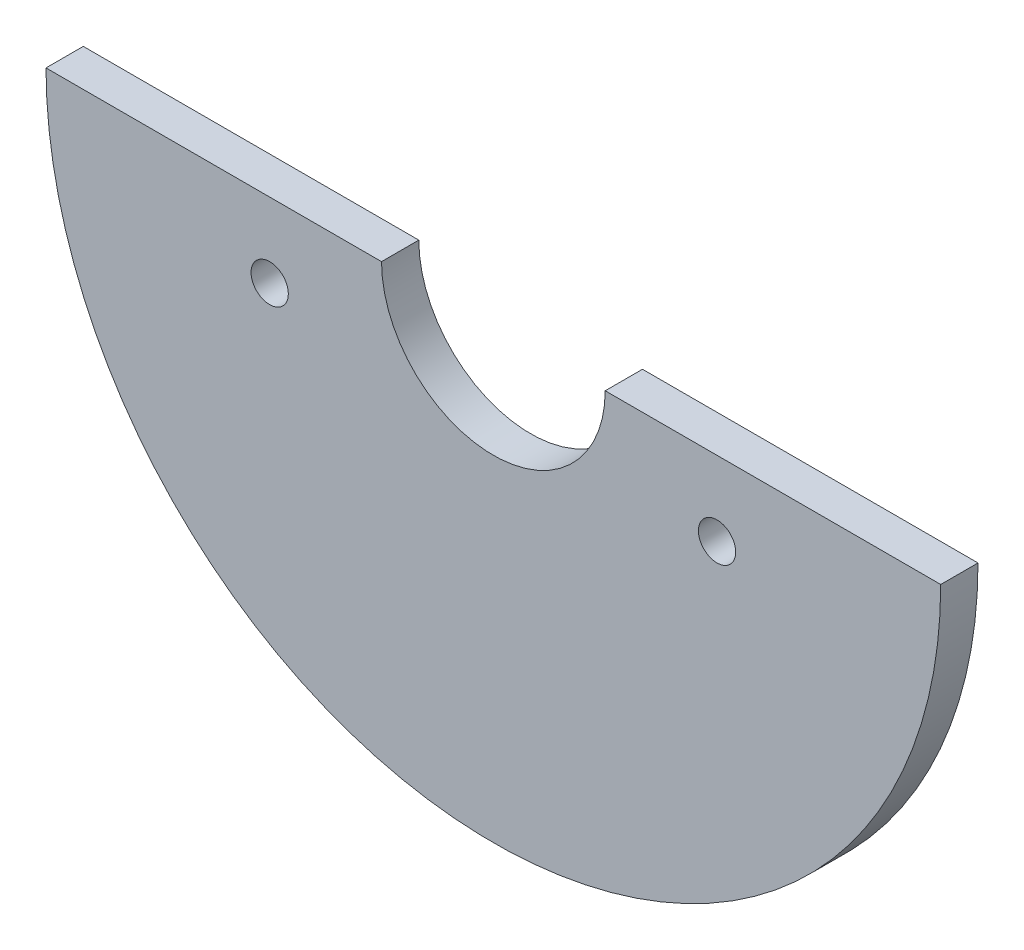
ISO-10303-21;
HEADER;
FILE_DESCRIPTION(('STEP AP214'),'2;1');
FILE_NAME('part.step','',(''),(''),'','','');
FILE_SCHEMA(('AUTOMOTIVE_DESIGN { 1 0 10303 214 1 1 1 1 }'));
ENDSEC;
DATA;
#1=APPLICATION_CONTEXT('core data for automotive mechanical design processes');
#2=APPLICATION_PROTOCOL_DEFINITION('international standard','automotive_design',2000,#1);
#3=PRODUCT_CONTEXT('',#1,'mechanical');
#4=PRODUCT('Part','Part','',(#3));
#5=PRODUCT_RELATED_PRODUCT_CATEGORY('part','',(#4));
#6=PRODUCT_DEFINITION_FORMATION('','',#4);
#7=PRODUCT_DEFINITION_CONTEXT('part definition',#1,'design');
#8=PRODUCT_DEFINITION('design','',#6,#7);
#9=PRODUCT_DEFINITION_SHAPE('','',#8);
#10=(LENGTH_UNIT() NAMED_UNIT(*) SI_UNIT(.MILLI.,.METRE.));
#11=(NAMED_UNIT(*) PLANE_ANGLE_UNIT() SI_UNIT($,.RADIAN.));
#12=(NAMED_UNIT(*) SI_UNIT($,.STERADIAN.) SOLID_ANGLE_UNIT());
#13=UNCERTAINTY_MEASURE_WITH_UNIT(LENGTH_MEASURE(1.E-05),#10,'distance_accuracy_value','');
#14=(GEOMETRIC_REPRESENTATION_CONTEXT(3) GLOBAL_UNCERTAINTY_ASSIGNED_CONTEXT((#13)) GLOBAL_UNIT_ASSIGNED_CONTEXT((#10,
#11,#12)) REPRESENTATION_CONTEXT('',''));
#15=CARTESIAN_POINT('',(0.,0.,0.));
#16=DIRECTION('',(0.,0.,1.));
#17=DIRECTION('',(1.,0.,0.));
#18=AXIS2_PLACEMENT_3D('',#15,#16,#17);
#19=CARTESIAN_POINT('',(0.,0.,5.));
#20=DIRECTION('',(0.,0.,1.));
#21=DIRECTION('',(1.,0.,0.));
#22=AXIS2_PLACEMENT_3D('',#19,#20,#21);
#23=PLANE('',#22);
#24=CARTESIAN_POINT('',(30.,-10.,5.));
#25=DIRECTION('',(0.,0.,1.));
#26=DIRECTION('',(1.,0.,0.));
#27=AXIS2_PLACEMENT_3D('',#24,#25,#26);
#28=CIRCLE('',#27,2.5);
#29=CARTESIAN_POINT('',(32.5,-10.,5.));
#30=VERTEX_POINT('',#29);
#31=EDGE_CURVE('E104',#30,#30,#28,.T.);
#32=ORIENTED_EDGE('',*,*,#31,.F.);
#33=EDGE_LOOP('',(#32));
#34=FACE_BOUND('',#33,.T.);
#35=CARTESIAN_POINT('',(0.,0.,5.));
#36=DIRECTION('',(0.,0.,1.));
#37=DIRECTION('',(1.,0.,0.));
#38=AXIS2_PLACEMENT_3D('',#35,#36,#37);
#39=CIRCLE('',#38,60.);
#40=CARTESIAN_POINT('',(-60.,0.,5.));
#41=VERTEX_POINT('',#40);
#42=CARTESIAN_POINT('',(60.,0.,5.));
#43=VERTEX_POINT('',#42);
#44=EDGE_CURVE('E89',#41,#43,#39,.T.);
#45=ORIENTED_EDGE('',*,*,#44,.T.);
#46=DIRECTION('',(-1.,0.,0.));
#47=VECTOR('',#46,1.);
#48=CARTESIAN_POINT('',(15.,0.,5.));
#49=LINE('',#48,#47);
#50=CARTESIAN_POINT('',(15.,0.,5.));
#51=VERTEX_POINT('',#50);
#52=EDGE_CURVE('E84',#43,#51,#49,.T.);
#53=ORIENTED_EDGE('',*,*,#52,.T.);
#54=CARTESIAN_POINT('',(0.,0.,5.));
#55=DIRECTION('',(0.,0.,-1.));
#56=DIRECTION('',(1.,0.,0.));
#57=AXIS2_PLACEMENT_3D('',#54,#55,#56);
#58=CIRCLE('',#57,15.);
#59=CARTESIAN_POINT('',(-15.,0.,5.));
#60=VERTEX_POINT('',#59);
#61=EDGE_CURVE('E87',#51,#60,#58,.T.);
#62=ORIENTED_EDGE('',*,*,#61,.T.);
#63=DIRECTION('',(-1.,0.,0.));
#64=VECTOR('',#63,1.);
#65=CARTESIAN_POINT('',(-60.,0.,5.));
#66=LINE('',#65,#64);
#67=EDGE_CURVE('E54',#60,#41,#66,.T.);
#68=ORIENTED_EDGE('',*,*,#67,.T.);
#69=EDGE_LOOP('',(#45,#53,#62,#68));
#70=FACE_BOUND('',#69,.T.);
#71=CARTESIAN_POINT('',(-30.,-10.,5.));
#72=DIRECTION('',(0.,0.,1.));
#73=DIRECTION('',(1.,0.,0.));
#74=AXIS2_PLACEMENT_3D('',#71,#72,#73);
#75=CIRCLE('',#74,2.5);
#76=CARTESIAN_POINT('',(-27.5,-10.,5.));
#77=VERTEX_POINT('',#76);
#78=EDGE_CURVE('E119',#77,#77,#75,.T.);
#79=ORIENTED_EDGE('',*,*,#78,.F.);
#80=EDGE_LOOP('',(#79));
#81=FACE_BOUND('',#80,.T.);
#82=ADVANCED_FACE('F37',(#34,#70,#81),#23,.T.);
#83=CARTESIAN_POINT('',(0.,0.,0.));
#84=DIRECTION('',(0.,0.,1.));
#85=DIRECTION('',(1.,0.,0.));
#86=AXIS2_PLACEMENT_3D('',#83,#84,#85);
#87=PLANE('',#86);
#88=CARTESIAN_POINT('',(30.,-10.,0.));
#89=DIRECTION('',(0.,0.,1.));
#90=DIRECTION('',(1.,0.,0.));
#91=AXIS2_PLACEMENT_3D('',#88,#89,#90);
#92=CIRCLE('',#91,2.5);
#93=CARTESIAN_POINT('',(32.5,-10.,0.));
#94=VERTEX_POINT('',#93);
#95=EDGE_CURVE('E116',#94,#94,#92,.T.);
#96=ORIENTED_EDGE('',*,*,#95,.T.);
#97=EDGE_LOOP('',(#96));
#98=FACE_BOUND('',#97,.T.);
#99=CARTESIAN_POINT('',(0.,0.,0.));
#100=DIRECTION('',(0.,0.,1.));
#101=DIRECTION('',(1.,0.,0.));
#102=AXIS2_PLACEMENT_3D('',#99,#100,#101);
#103=CIRCLE('',#102,60.);
#104=CARTESIAN_POINT('',(-60.,0.,0.));
#105=VERTEX_POINT('',#104);
#106=CARTESIAN_POINT('',(60.,0.,0.));
#107=VERTEX_POINT('',#106);
#108=EDGE_CURVE('E101',#105,#107,#103,.T.);
#109=ORIENTED_EDGE('',*,*,#108,.F.);
#110=DIRECTION('',(-1.,0.,0.));
#111=VECTOR('',#110,1.);
#112=CARTESIAN_POINT('',(-60.,0.,0.));
#113=LINE('',#112,#111);
#114=CARTESIAN_POINT('',(-15.,0.,0.));
#115=VERTEX_POINT('',#114);
#116=EDGE_CURVE('E77',#115,#105,#113,.T.);
#117=ORIENTED_EDGE('',*,*,#116,.F.);
#118=CARTESIAN_POINT('',(0.,0.,0.));
#119=DIRECTION('',(0.,0.,-1.));
#120=DIRECTION('',(1.,0.,0.));
#121=AXIS2_PLACEMENT_3D('',#118,#119,#120);
#122=CIRCLE('',#121,15.);
#123=CARTESIAN_POINT('',(15.,0.,0.));
#124=VERTEX_POINT('',#123);
#125=EDGE_CURVE('E71',#124,#115,#122,.T.);
#126=ORIENTED_EDGE('',*,*,#125,.F.);
#127=DIRECTION('',(-1.,0.,0.));
#128=VECTOR('',#127,1.);
#129=CARTESIAN_POINT('',(15.,0.,0.));
#130=LINE('',#129,#128);
#131=EDGE_CURVE('E93',#107,#124,#130,.T.);
#132=ORIENTED_EDGE('',*,*,#131,.F.);
#133=EDGE_LOOP('',(#109,#117,#126,#132));
#134=FACE_BOUND('',#133,.T.);
#135=CARTESIAN_POINT('',(-30.,-10.,0.));
#136=DIRECTION('',(0.,0.,1.));
#137=DIRECTION('',(1.,0.,0.));
#138=AXIS2_PLACEMENT_3D('',#135,#136,#137);
#139=CIRCLE('',#138,2.5);
#140=CARTESIAN_POINT('',(-27.5,-10.,0.));
#141=VERTEX_POINT('',#140);
#142=EDGE_CURVE('E122',#141,#141,#139,.T.);
#143=ORIENTED_EDGE('',*,*,#142,.T.);
#144=EDGE_LOOP('',(#143));
#145=FACE_BOUND('',#144,.T.);
#146=ADVANCED_FACE('F112',(#98,#134,#145),#87,.F.);
#147=CARTESIAN_POINT('',(0.,0.,5.));
#148=DIRECTION('',(0.,0.,-1.));
#149=DIRECTION('',(-1.,0.,0.));
#150=AXIS2_PLACEMENT_3D('',#147,#148,#149);
#151=CYLINDRICAL_SURFACE('',#150,60.);
#152=ORIENTED_EDGE('',*,*,#108,.T.);
#153=DIRECTION('',(0.,0.,-1.));
#154=VECTOR('',#153,1.);
#155=CARTESIAN_POINT('',(60.,0.,5.));
#156=LINE('',#155,#154);
#157=EDGE_CURVE('E11',#43,#107,#156,.T.);
#158=ORIENTED_EDGE('',*,*,#157,.F.);
#159=ORIENTED_EDGE('',*,*,#44,.F.);
#160=DIRECTION('',(0.,0.,-1.));
#161=VECTOR('',#160,1.);
#162=CARTESIAN_POINT('',(-60.,0.,5.));
#163=LINE('',#162,#161);
#164=EDGE_CURVE('E97',#41,#105,#163,.T.);
#165=ORIENTED_EDGE('',*,*,#164,.T.);
#166=EDGE_LOOP('',(#152,#158,#159,#165));
#167=FACE_BOUND('',#166,.T.);
#168=ADVANCED_FACE('F39',(#167),#151,.T.);
#169=CARTESIAN_POINT('',(15.,0.,5.));
#170=DIRECTION('',(0.,-1.,0.));
#171=DIRECTION('',(1.,0.,0.));
#172=AXIS2_PLACEMENT_3D('',#169,#170,#171);
#173=PLANE('',#172);
#174=ORIENTED_EDGE('',*,*,#131,.T.);
#175=DIRECTION('',(0.,0.,-1.));
#176=VECTOR('',#175,1.);
#177=CARTESIAN_POINT('',(15.,0.,5.));
#178=LINE('',#177,#176);
#179=EDGE_CURVE('E46',#51,#124,#178,.T.);
#180=ORIENTED_EDGE('',*,*,#179,.F.);
#181=ORIENTED_EDGE('',*,*,#52,.F.);
#182=ORIENTED_EDGE('',*,*,#157,.T.);
#183=EDGE_LOOP('',(#174,#180,#181,#182));
#184=FACE_BOUND('',#183,.T.);
#185=ADVANCED_FACE('F92',(#184),#173,.F.);
#186=CARTESIAN_POINT('',(0.,0.,5.));
#187=DIRECTION('',(0.,0.,-1.));
#188=DIRECTION('',(-1.,0.,0.));
#189=AXIS2_PLACEMENT_3D('',#186,#187,#188);
#190=CYLINDRICAL_SURFACE('',#189,15.);
#191=ORIENTED_EDGE('',*,*,#125,.T.);
#192=DIRECTION('',(0.,0.,-1.));
#193=VECTOR('',#192,1.);
#194=CARTESIAN_POINT('',(-15.,0.,5.));
#195=LINE('',#194,#193);
#196=EDGE_CURVE('E94',#60,#115,#195,.T.);
#197=ORIENTED_EDGE('',*,*,#196,.F.);
#198=ORIENTED_EDGE('',*,*,#61,.F.);
#199=ORIENTED_EDGE('',*,*,#179,.T.);
#200=EDGE_LOOP('',(#191,#197,#198,#199));
#201=FACE_BOUND('',#200,.T.);
#202=ADVANCED_FACE('F95',(#201),#190,.F.);
#203=CARTESIAN_POINT('',(-60.,0.,5.));
#204=DIRECTION('',(0.,-1.,0.));
#205=DIRECTION('',(1.,0.,0.));
#206=AXIS2_PLACEMENT_3D('',#203,#204,#205);
#207=PLANE('',#206);
#208=ORIENTED_EDGE('',*,*,#116,.T.);
#209=ORIENTED_EDGE('',*,*,#164,.F.);
#210=ORIENTED_EDGE('',*,*,#67,.F.);
#211=ORIENTED_EDGE('',*,*,#196,.T.);
#212=EDGE_LOOP('',(#208,#209,#210,#211));
#213=FACE_BOUND('',#212,.T.);
#214=ADVANCED_FACE('F109',(#213),#207,.F.);
#215=CARTESIAN_POINT('',(30.,-10.,5.));
#216=DIRECTION('',(0.,0.,-1.));
#217=DIRECTION('',(-1.,0.,0.));
#218=AXIS2_PLACEMENT_3D('',#215,#216,#217);
#219=CYLINDRICAL_SURFACE('',#218,2.5);
#220=ORIENTED_EDGE('',*,*,#31,.T.);
#221=EDGE_LOOP('',(#220));
#222=FACE_BOUND('',#221,.T.);
#223=ORIENTED_EDGE('',*,*,#95,.F.);
#224=EDGE_LOOP('',(#223));
#225=FACE_BOUND('',#224,.T.);
#226=ADVANCED_FACE('F140',(#222,#225),#219,.F.);
#227=CARTESIAN_POINT('',(-30.,-10.,5.));
#228=DIRECTION('',(0.,0.,-1.));
#229=DIRECTION('',(-1.,0.,0.));
#230=AXIS2_PLACEMENT_3D('',#227,#228,#229);
#231=CYLINDRICAL_SURFACE('',#230,2.5);
#232=ORIENTED_EDGE('',*,*,#78,.T.);
#233=EDGE_LOOP('',(#232));
#234=FACE_BOUND('',#233,.T.);
#235=ORIENTED_EDGE('',*,*,#142,.F.);
#236=EDGE_LOOP('',(#235));
#237=FACE_BOUND('',#236,.T.);
#238=ADVANCED_FACE('F128',(#234,#237),#231,.F.);
#239=CLOSED_SHELL('',(#82,#146,#168,#185,#202,#214,#226,#238));
#240=MANIFOLD_SOLID_BREP('B2',#239);
#241=ADVANCED_BREP_SHAPE_REPRESENTATION('',(#18,#240),#14);
#242=SHAPE_DEFINITION_REPRESENTATION(#9,#241);
ENDSEC;
END-ISO-10303-21;
